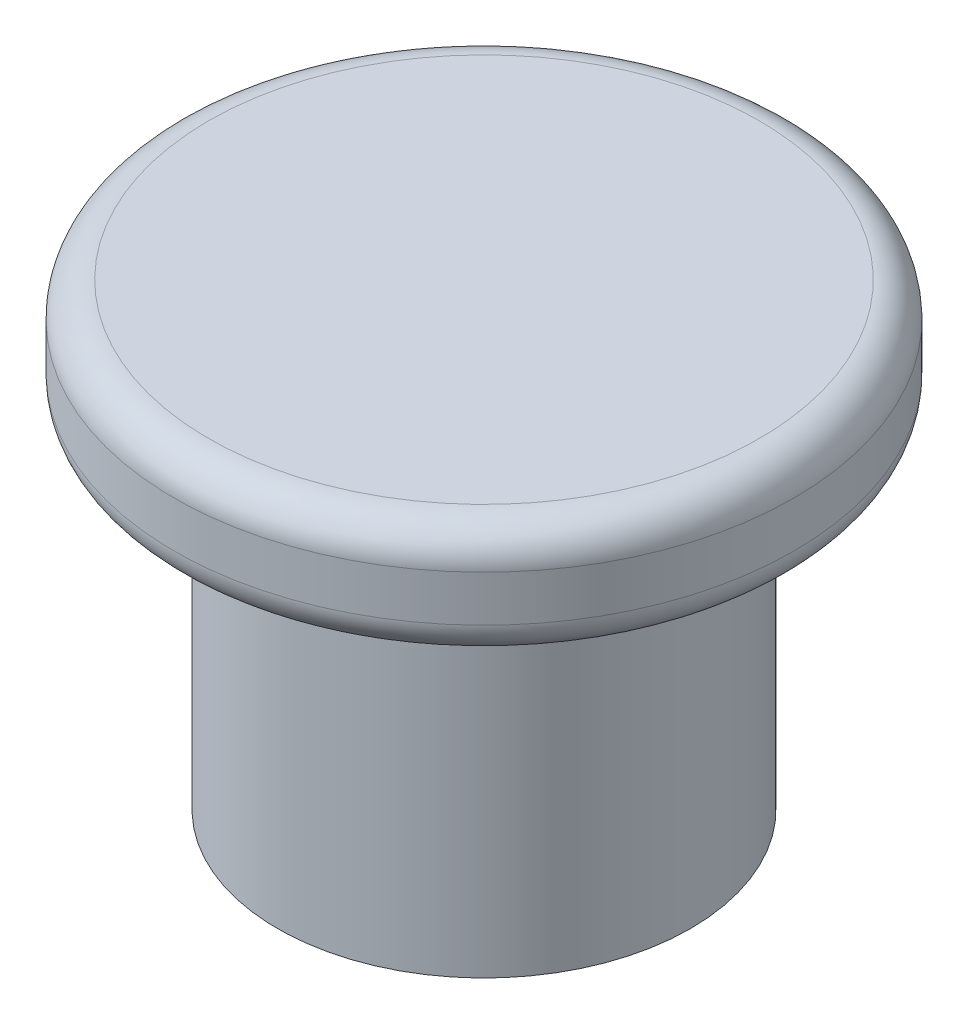
ISO-10303-21;
HEADER;
FILE_DESCRIPTION(('STEP AP214'),'2;1');
FILE_NAME('part.step','',(''),(''),'','','');
FILE_SCHEMA(('AUTOMOTIVE_DESIGN { 1 0 10303 214 1 1 1 1 }'));
ENDSEC;
DATA;
#1=APPLICATION_CONTEXT('core data for automotive mechanical design processes');
#2=APPLICATION_PROTOCOL_DEFINITION('international standard','automotive_design',2000,#1);
#3=PRODUCT_CONTEXT('',#1,'mechanical');
#4=PRODUCT('Part','Part','',(#3));
#5=PRODUCT_RELATED_PRODUCT_CATEGORY('part','',(#4));
#6=PRODUCT_DEFINITION_FORMATION('','',#4);
#7=PRODUCT_DEFINITION_CONTEXT('part definition',#1,'design');
#8=PRODUCT_DEFINITION('design','',#6,#7);
#9=PRODUCT_DEFINITION_SHAPE('','',#8);
#10=(LENGTH_UNIT() NAMED_UNIT(*) SI_UNIT(.MILLI.,.METRE.));
#11=(NAMED_UNIT(*) PLANE_ANGLE_UNIT() SI_UNIT($,.RADIAN.));
#12=(NAMED_UNIT(*) SI_UNIT($,.STERADIAN.) SOLID_ANGLE_UNIT());
#13=UNCERTAINTY_MEASURE_WITH_UNIT(LENGTH_MEASURE(1.E-05),#10,'distance_accuracy_value','');
#14=(GEOMETRIC_REPRESENTATION_CONTEXT(3) GLOBAL_UNCERTAINTY_ASSIGNED_CONTEXT((#13)) GLOBAL_UNIT_ASSIGNED_CONTEXT((#10,
#11,#12)) REPRESENTATION_CONTEXT('',''));
#15=CARTESIAN_POINT('',(0.,0.,0.));
#16=DIRECTION('',(0.,0.,1.));
#17=DIRECTION('',(1.,0.,0.));
#18=AXIS2_PLACEMENT_3D('',#15,#16,#17);
#19=CARTESIAN_POINT('',(0.,20.,0.));
#20=DIRECTION('',(0.,-1.,0.));
#21=DIRECTION('',(1.,0.,0.));
#22=AXIS2_PLACEMENT_3D('',#19,#20,#21);
#23=PLANE('',#22);
#24=CARTESIAN_POINT('',(0.,20.,0.));
#25=DIRECTION('',(0.,1.,0.));
#26=DIRECTION('',(-1.,0.,0.));
#27=AXIS2_PLACEMENT_3D('',#24,#25,#26);
#28=CIRCLE('',#27,24.);
#29=CARTESIAN_POINT('',(-24.,20.,0.));
#30=VERTEX_POINT('',#29);
#31=EDGE_CURVE('E10',#30,#30,#28,.T.);
#32=ORIENTED_EDGE('',*,*,#31,.T.);
#33=EDGE_LOOP('',(#32));
#34=FACE_BOUND('',#33,.T.);
#35=ADVANCED_FACE('F31',(#34),#23,.F.);
#36=CARTESIAN_POINT('',(0.,17.,0.));
#37=DIRECTION('',(0.,1.,0.));
#38=DIRECTION('',(-1.,0.,0.));
#39=AXIS2_PLACEMENT_3D('',#36,#37,#38);
#40=TOROIDAL_SURFACE('',#39,24.,3.);
#41=ORIENTED_EDGE('',*,*,#31,.F.);
#42=EDGE_LOOP('',(#41));
#43=FACE_BOUND('',#42,.T.);
#44=CARTESIAN_POINT('',(0.,17.,0.));
#45=DIRECTION('',(0.,1.,0.));
#46=DIRECTION('',(-1.,0.,0.));
#47=AXIS2_PLACEMENT_3D('',#44,#45,#46);
#48=CIRCLE('',#47,27.);
#49=CARTESIAN_POINT('',(-27.,17.,0.));
#50=VERTEX_POINT('',#49);
#51=EDGE_CURVE('E37',#50,#50,#48,.T.);
#52=ORIENTED_EDGE('',*,*,#51,.T.);
#53=EDGE_LOOP('',(#52));
#54=FACE_BOUND('',#53,.T.);
#55=ADVANCED_FACE('F86',(#43,#54),#40,.T.);
#56=CARTESIAN_POINT('',(0.,20.,0.));
#57=DIRECTION('',(0.,1.,0.));
#58=DIRECTION('',(-1.,0.,0.));
#59=AXIS2_PLACEMENT_3D('',#56,#57,#58);
#60=CYLINDRICAL_SURFACE('',#59,27.);
#61=ORIENTED_EDGE('',*,*,#51,.F.);
#62=EDGE_LOOP('',(#61));
#63=FACE_BOUND('',#62,.T.);
#64=CARTESIAN_POINT('',(0.,13.,0.));
#65=DIRECTION('',(0.,1.,0.));
#66=DIRECTION('',(-1.,0.,0.));
#67=AXIS2_PLACEMENT_3D('',#64,#65,#66);
#68=CIRCLE('',#67,27.);
#69=CARTESIAN_POINT('',(-27.,13.,0.));
#70=VERTEX_POINT('',#69);
#71=EDGE_CURVE('E41',#70,#70,#68,.T.);
#72=ORIENTED_EDGE('',*,*,#71,.T.);
#73=EDGE_LOOP('',(#72));
#74=FACE_BOUND('',#73,.T.);
#75=ADVANCED_FACE('F90',(#63,#74),#60,.T.);
#76=CARTESIAN_POINT('',(0.,13.,0.));
#77=DIRECTION('',(0.,1.,0.));
#78=DIRECTION('',(-1.,0.,0.));
#79=AXIS2_PLACEMENT_3D('',#76,#77,#78);
#80=TOROIDAL_SURFACE('',#79,24.,3.);
#81=ORIENTED_EDGE('',*,*,#71,.F.);
#82=EDGE_LOOP('',(#81));
#83=FACE_BOUND('',#82,.T.);
#84=CARTESIAN_POINT('',(0.,10.,0.));
#85=DIRECTION('',(0.,1.,0.));
#86=DIRECTION('',(-1.,0.,0.));
#87=AXIS2_PLACEMENT_3D('',#84,#85,#86);
#88=CIRCLE('',#87,24.);
#89=CARTESIAN_POINT('',(-24.,9.99999999999999,0.));
#90=VERTEX_POINT('',#89);
#91=EDGE_CURVE('E45',#90,#90,#88,.T.);
#92=ORIENTED_EDGE('',*,*,#91,.T.);
#93=EDGE_LOOP('',(#92));
#94=FACE_BOUND('',#93,.T.);
#95=ADVANCED_FACE('F81',(#83,#94),#80,.T.);
#96=CARTESIAN_POINT('',(24.,10.,0.));
#97=DIRECTION('',(0.,1.,0.));
#98=DIRECTION('',(-1.,0.,0.));
#99=AXIS2_PLACEMENT_3D('',#96,#97,#98);
#100=PLANE('',#99);
#101=ORIENTED_EDGE('',*,*,#91,.F.);
#102=EDGE_LOOP('',(#101));
#103=FACE_BOUND('',#102,.T.);
#104=CARTESIAN_POINT('',(0.,10.,0.));
#105=DIRECTION('',(0.,1.,0.));
#106=DIRECTION('',(-1.,0.,0.));
#107=AXIS2_PLACEMENT_3D('',#104,#105,#106);
#108=CIRCLE('',#107,18.);
#109=CARTESIAN_POINT('',(-18.,9.99999999999999,0.));
#110=VERTEX_POINT('',#109);
#111=EDGE_CURVE('E50',#110,#110,#108,.T.);
#112=ORIENTED_EDGE('',*,*,#111,.T.);
#113=EDGE_LOOP('',(#112));
#114=FACE_BOUND('',#113,.T.);
#115=ADVANCED_FACE('F75',(#103,#114),#100,.F.);
#116=CARTESIAN_POINT('',(0.,20.,0.));
#117=DIRECTION('',(0.,1.,0.));
#118=DIRECTION('',(-1.,0.,0.));
#119=AXIS2_PLACEMENT_3D('',#116,#117,#118);
#120=CYLINDRICAL_SURFACE('',#119,18.);
#121=ORIENTED_EDGE('',*,*,#111,.F.);
#122=EDGE_LOOP('',(#121));
#123=FACE_BOUND('',#122,.T.);
#124=CARTESIAN_POINT('',(0.,-20.,0.));
#125=DIRECTION('',(0.,1.,0.));
#126=DIRECTION('',(-1.,0.,0.));
#127=AXIS2_PLACEMENT_3D('',#124,#125,#126);
#128=CIRCLE('',#127,18.);
#129=CARTESIAN_POINT('',(-18.,-20.,0.));
#130=VERTEX_POINT('',#129);
#131=EDGE_CURVE('E53',#130,#130,#128,.T.);
#132=ORIENTED_EDGE('',*,*,#131,.T.);
#133=EDGE_LOOP('',(#132));
#134=FACE_BOUND('',#133,.T.);
#135=ADVANCED_FACE('F70',(#123,#134),#120,.T.);
#136=CARTESIAN_POINT('',(0.,-20.,0.));
#137=DIRECTION('',(0.,1.,0.));
#138=DIRECTION('',(-1.,0.,0.));
#139=AXIS2_PLACEMENT_3D('',#136,#137,#138);
#140=PLANE('',#139);
#141=CARTESIAN_POINT('',(0.,-20.,0.));
#142=DIRECTION('',(0.,-1.,0.));
#143=DIRECTION('',(1.,0.,0.));
#144=AXIS2_PLACEMENT_3D('',#141,#142,#143);
#145=CIRCLE('',#144,14.);
#146=CARTESIAN_POINT('',(14.,-20.,0.));
#147=VERTEX_POINT('',#146);
#148=EDGE_CURVE('E59',#147,#147,#145,.T.);
#149=ORIENTED_EDGE('',*,*,#148,.F.);
#150=EDGE_LOOP('',(#149));
#151=FACE_BOUND('',#150,.T.);
#152=ORIENTED_EDGE('',*,*,#131,.F.);
#153=EDGE_LOOP('',(#152));
#154=FACE_BOUND('',#153,.T.);
#155=ADVANCED_FACE('F66',(#151,#154),#140,.F.);
#156=CARTESIAN_POINT('',(24.,10.,0.));
#157=DIRECTION('',(0.,1.,0.));
#158=DIRECTION('',(-1.,0.,0.));
#159=AXIS2_PLACEMENT_3D('',#156,#157,#158);
#160=PLANE('',#159);
#161=CARTESIAN_POINT('',(0.,9.99999999999999,0.));
#162=DIRECTION('',(0.,1.,0.));
#163=DIRECTION('',(-1.,0.,0.));
#164=AXIS2_PLACEMENT_3D('',#161,#162,#163);
#165=CIRCLE('',#164,14.);
#166=CARTESIAN_POINT('',(14.,9.99999999999999,0.));
#167=VERTEX_POINT('',#166);
#168=EDGE_CURVE('E56',#167,#167,#165,.F.);
#169=ORIENTED_EDGE('',*,*,#168,.T.);
#170=EDGE_LOOP('',(#169));
#171=FACE_BOUND('',#170,.T.);
#172=ADVANCED_FACE('F69',(#171),#160,.F.);
#173=CARTESIAN_POINT('',(0.,49.5979797464467,0.));
#174=DIRECTION('',(0.,-1.,0.));
#175=DIRECTION('',(1.,0.,0.));
#176=AXIS2_PLACEMENT_3D('',#173,#174,#175);
#177=CYLINDRICAL_SURFACE('',#176,14.);
#178=CARTESIAN_POINT('',(14.,-20.,0.));
#179=CARTESIAN_POINT('',(14.,-19.6875,0.));
#180=CARTESIAN_POINT('',(14.,-19.375,0.));
#181=CARTESIAN_POINT('',(14.,-18.75,0.));
#182=CARTESIAN_POINT('',(14.,-18.4375,0.));
#183=CARTESIAN_POINT('',(14.,-17.8125,0.));
#184=CARTESIAN_POINT('',(14.,-17.5,0.));
#185=CARTESIAN_POINT('',(14.,-16.875,0.));
#186=CARTESIAN_POINT('',(14.,-16.5625,0.));
#187=CARTESIAN_POINT('',(14.,-15.9375,0.));
#188=CARTESIAN_POINT('',(14.,-15.625,0.));
#189=CARTESIAN_POINT('',(14.,-15.,0.));
#190=CARTESIAN_POINT('',(14.,-14.6875,0.));
#191=CARTESIAN_POINT('',(14.,-14.0625,0.));
#192=CARTESIAN_POINT('',(14.,-13.75,0.));
#193=CARTESIAN_POINT('',(14.,-13.125,0.));
#194=CARTESIAN_POINT('',(14.,-12.8125,0.));
#195=CARTESIAN_POINT('',(14.,-12.1875,0.));
#196=CARTESIAN_POINT('',(14.,-11.875,0.));
#197=CARTESIAN_POINT('',(14.,-11.25,0.));
#198=CARTESIAN_POINT('',(14.,-10.9375,0.));
#199=CARTESIAN_POINT('',(14.,-10.3125,0.));
#200=CARTESIAN_POINT('',(14.,-9.99999999999999,0.));
#201=CARTESIAN_POINT('',(14.,-9.37499999999999,0.));
#202=CARTESIAN_POINT('',(14.,-9.06249999999999,0.));
#203=CARTESIAN_POINT('',(14.,-8.43749999999999,0.));
#204=CARTESIAN_POINT('',(14.,-8.125,0.));
#205=CARTESIAN_POINT('',(14.,-7.5,0.));
#206=CARTESIAN_POINT('',(14.,-7.18749999999999,0.));
#207=CARTESIAN_POINT('',(14.,-6.56249999999999,0.));
#208=CARTESIAN_POINT('',(14.,-6.25,0.));
#209=CARTESIAN_POINT('',(14.,-5.625,0.));
#210=CARTESIAN_POINT('',(14.,-5.3125,0.));
#211=CARTESIAN_POINT('',(14.,-4.6875,0.));
#212=CARTESIAN_POINT('',(14.,-4.375,0.));
#213=CARTESIAN_POINT('',(14.,-3.75,0.));
#214=CARTESIAN_POINT('',(14.,-3.4375,0.));
#215=CARTESIAN_POINT('',(14.,-2.8125,0.));
#216=CARTESIAN_POINT('',(14.,-2.5,0.));
#217=CARTESIAN_POINT('',(14.,-1.875,0.));
#218=CARTESIAN_POINT('',(14.,-1.5625,0.));
#219=CARTESIAN_POINT('',(14.,-0.937500000000001,0.));
#220=CARTESIAN_POINT('',(14.,-0.625000000000001,0.));
#221=CARTESIAN_POINT('',(14.,0.,0.));
#222=CARTESIAN_POINT('',(14.,0.3125,0.));
#223=CARTESIAN_POINT('',(14.,0.937499999999998,0.));
#224=CARTESIAN_POINT('',(14.,1.25,0.));
#225=CARTESIAN_POINT('',(14.,1.875,0.));
#226=CARTESIAN_POINT('',(14.,2.1875,0.));
#227=CARTESIAN_POINT('',(14.,2.8125,0.));
#228=CARTESIAN_POINT('',(14.,3.125,0.));
#229=CARTESIAN_POINT('',(14.,3.75,0.));
#230=CARTESIAN_POINT('',(14.,4.0625,0.));
#231=CARTESIAN_POINT('',(14.,4.6875,0.));
#232=CARTESIAN_POINT('',(14.,5.,0.));
#233=CARTESIAN_POINT('',(14.,5.625,0.));
#234=CARTESIAN_POINT('',(14.,5.9375,0.));
#235=CARTESIAN_POINT('',(14.,6.5625,0.));
#236=CARTESIAN_POINT('',(14.,6.875,0.));
#237=CARTESIAN_POINT('',(14.,7.5,0.));
#238=CARTESIAN_POINT('',(14.,7.8125,0.));
#239=CARTESIAN_POINT('',(14.,8.43749999999999,0.));
#240=CARTESIAN_POINT('',(14.,8.74999999999999,0.));
#241=CARTESIAN_POINT('',(14.,9.37499999999999,0.));
#242=CARTESIAN_POINT('',(14.,9.68749999999999,0.));
#243=CARTESIAN_POINT('',(14.,9.99999999999999,0.));
#244=B_SPLINE_CURVE_WITH_KNOTS('',3,(#178,#179,#180,#181,#182,#183,#184,#185,#186,#187,#188,
#189,#190,#191,#192,#193,#194,#195,#196,#197,#198,#199,#200,#201,#202,#203,#204,#205,#206,#207,
#208,#209,#210,#211,#212,#213,#214,#215,#216,#217,#218,#219,#220,#221,#222,#223,#224,#225,#226,
#227,#228,#229,#230,#231,#232,#233,#234,#235,#236,#237,#238,#239,#240,#241,#242,#243),
.UNSPECIFIED.,.F.,.F.,(4,2,2,2,2,2,2,2,2,2,2,2,2,2,2,2,2,2,2,2,2,2,2,2,2,2,2,2,2,2,2,2,4),(0.,
0.937499999999994,1.875,2.8125,3.75,4.6875,5.62499999999999,6.5625,7.49999999999999,
8.43749999999999,9.37499999999999,10.3125,11.25,12.1875,13.125,14.0625,15.,15.9375,16.875,
17.8125,18.75,19.6875,20.625,21.5625,22.5,23.4375,24.375,25.3125,26.25,27.1875,28.125,29.0625,
30.),.UNSPECIFIED.);
#245=EDGE_CURVE('BSEAM63',#147,#167,#244,.T.);
#246=ORIENTED_EDGE('',*,*,#148,.T.);
#247=ORIENTED_EDGE('',*,*,#168,.F.);
#248=ORIENTED_EDGE('',*,*,#245,.T.);
#249=ORIENTED_EDGE('',*,*,#245,.F.);
#250=EDGE_LOOP('',(#246,#248,#247,#249));
#251=FACE_BOUND('',#250,.T.);
#252=ADVANCED_FACE('F63',(#251),#177,.F.);
#253=CLOSED_SHELL('',(#35,#55,#75,#95,#115,#135,#155,#172,#252));
#254=MANIFOLD_SOLID_BREP('B2',#253);
#255=ADVANCED_BREP_SHAPE_REPRESENTATION('',(#18,#254),#14);
#256=SHAPE_DEFINITION_REPRESENTATION(#9,#255);
ENDSEC;
END-ISO-10303-21;
